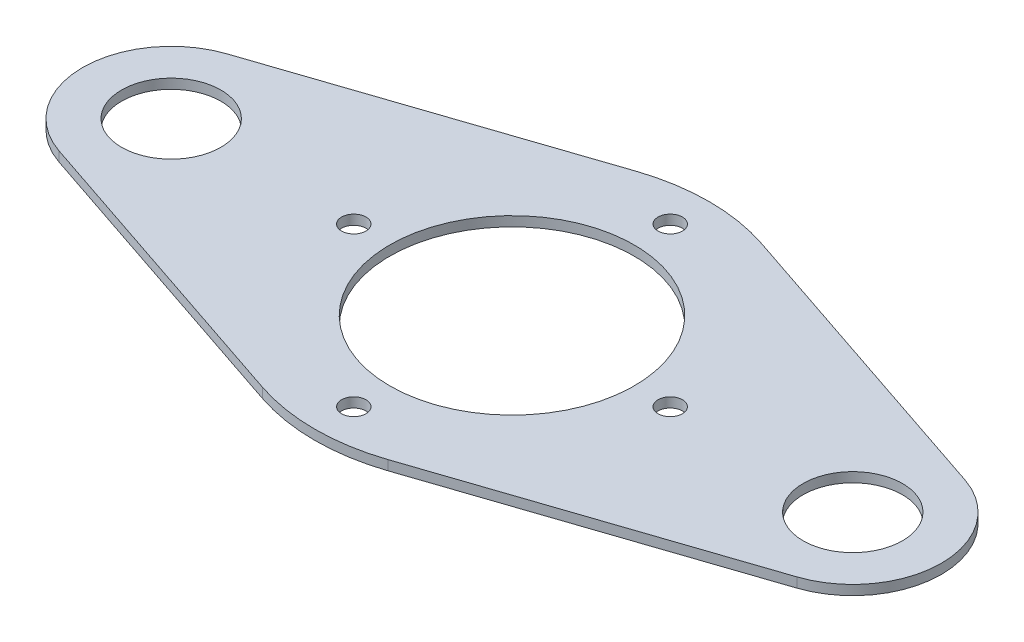
ISO-10303-21;
HEADER;
FILE_DESCRIPTION(('STEP AP214'),'2;1');
FILE_NAME('part.step','',(''),(''),'','','');
FILE_SCHEMA(('AUTOMOTIVE_DESIGN { 1 0 10303 214 1 1 1 1 }'));
ENDSEC;
DATA;
#1=APPLICATION_CONTEXT('core data for automotive mechanical design processes');
#2=APPLICATION_PROTOCOL_DEFINITION('international standard','automotive_design',2000,#1);
#3=PRODUCT_CONTEXT('',#1,'mechanical');
#4=PRODUCT('Part','Part','',(#3));
#5=PRODUCT_RELATED_PRODUCT_CATEGORY('part','',(#4));
#6=PRODUCT_DEFINITION_FORMATION('','',#4);
#7=PRODUCT_DEFINITION_CONTEXT('part definition',#1,'design');
#8=PRODUCT_DEFINITION('design','',#6,#7);
#9=PRODUCT_DEFINITION_SHAPE('','',#8);
#10=(LENGTH_UNIT() NAMED_UNIT(*) SI_UNIT(.MILLI.,.METRE.));
#11=(NAMED_UNIT(*) PLANE_ANGLE_UNIT() SI_UNIT($,.RADIAN.));
#12=(NAMED_UNIT(*) SI_UNIT($,.STERADIAN.) SOLID_ANGLE_UNIT());
#13=UNCERTAINTY_MEASURE_WITH_UNIT(LENGTH_MEASURE(1.E-05),#10,'distance_accuracy_value','');
#14=(GEOMETRIC_REPRESENTATION_CONTEXT(3) GLOBAL_UNCERTAINTY_ASSIGNED_CONTEXT((#13)) GLOBAL_UNIT_ASSIGNED_CONTEXT((#10,
#11,#12)) REPRESENTATION_CONTEXT('',''));
#15=CARTESIAN_POINT('',(0.,0.,0.));
#16=DIRECTION('',(0.,0.,1.));
#17=DIRECTION('',(1.,0.,0.));
#18=AXIS2_PLACEMENT_3D('',#15,#16,#17);
#19=CARTESIAN_POINT('',(16.3857214285714,2.54,-48.7551777585238));
#20=DIRECTION('',(0.318571428571429,0.,-0.947898857947386));
#21=DIRECTION('',(-0.947898857947386,0.,-0.318571428571429));
#22=AXIS2_PLACEMENT_3D('',#19,#20,#21);
#23=PLANE('',#22);
#24=DIRECTION('',(0.947898857947386,0.,0.318571428571429));
#25=VECTOR('',#24,1.);
#26=CARTESIAN_POINT('',(16.3857214285714,0.,-48.7551777585238));
#27=LINE('',#26,#25);
#28=CARTESIAN_POINT('',(16.3857214285714,0.,-48.7551777585238));
#29=VERTEX_POINT('',#28);
#30=CARTESIAN_POINT('',(96.26346,0.,-21.9097342025959));
#31=VERTEX_POINT('',#30);
#32=EDGE_CURVE('E150',#29,#31,#27,.T.);
#33=ORIENTED_EDGE('',*,*,#32,.F.);
#34=DIRECTION('',(0.,-1.,0.));
#35=VECTOR('',#34,1.);
#36=CARTESIAN_POINT('',(16.3857214285714,2.54,-48.7551777585238));
#37=LINE('',#36,#35);
#38=CARTESIAN_POINT('',(16.3857214285714,2.54,-48.7551777585238));
#39=VERTEX_POINT('',#38);
#40=EDGE_CURVE('E11',#39,#29,#37,.T.);
#41=ORIENTED_EDGE('',*,*,#40,.F.);
#42=DIRECTION('',(0.947898857947386,0.,0.318571428571429));
#43=VECTOR('',#42,1.);
#44=CARTESIAN_POINT('',(16.3857214285714,2.54,-48.7551777585238));
#45=LINE('',#44,#43);
#46=CARTESIAN_POINT('',(96.26346,2.54,-21.9097342025959));
#47=VERTEX_POINT('',#46);
#48=EDGE_CURVE('E259',#39,#47,#45,.T.);
#49=ORIENTED_EDGE('',*,*,#48,.T.);
#50=DIRECTION('',(0.,-1.,0.));
#51=VECTOR('',#50,1.);
#52=CARTESIAN_POINT('',(96.26346,2.54,-21.9097342025959));
#53=LINE('',#52,#51);
#54=EDGE_CURVE('E85',#47,#31,#53,.T.);
#55=ORIENTED_EDGE('',*,*,#54,.T.);
#56=EDGE_LOOP('',(#33,#41,#49,#55));
#57=FACE_BOUND('',#56,.T.);
#58=ADVANCED_FACE('F34',(#57),#23,.T.);
#59=CARTESIAN_POINT('',(0.,2.54,0.));
#60=DIRECTION('',(0.,-1.,0.));
#61=DIRECTION('',(0.,0.,-1.));
#62=AXIS2_PLACEMENT_3D('',#59,#60,#61);
#63=CYLINDRICAL_SURFACE('',#62,51.435);
#64=CARTESIAN_POINT('',(0.,0.,0.));
#65=DIRECTION('',(0.,1.,0.));
#66=DIRECTION('',(0.,0.,1.));
#67=AXIS2_PLACEMENT_3D('',#64,#65,#66);
#68=CIRCLE('',#67,51.435);
#69=CARTESIAN_POINT('',(-16.3857214285714,0.,-48.7551777585238));
#70=VERTEX_POINT('',#69);
#71=EDGE_CURVE('E148',#29,#70,#68,.T.);
#72=ORIENTED_EDGE('',*,*,#71,.T.);
#73=DIRECTION('',(0.,-1.,0.));
#74=VECTOR('',#73,1.);
#75=CARTESIAN_POINT('',(-16.3857214285714,2.54,-48.7551777585238));
#76=LINE('',#75,#74);
#77=CARTESIAN_POINT('',(-16.3857214285714,2.54,-48.7551777585238));
#78=VERTEX_POINT('',#77);
#79=EDGE_CURVE('E43',#78,#70,#76,.T.);
#80=ORIENTED_EDGE('',*,*,#79,.F.);
#81=CARTESIAN_POINT('',(0.,2.54,0.));
#82=DIRECTION('',(0.,1.,0.));
#83=DIRECTION('',(0.,0.,1.));
#84=AXIS2_PLACEMENT_3D('',#81,#82,#83);
#85=CIRCLE('',#84,51.435);
#86=EDGE_CURVE('E261',#39,#78,#85,.T.);
#87=ORIENTED_EDGE('',*,*,#86,.F.);
#88=ORIENTED_EDGE('',*,*,#40,.T.);
#89=EDGE_LOOP('',(#72,#80,#87,#88));
#90=FACE_BOUND('',#89,.T.);
#91=ADVANCED_FACE('F149',(#90),#63,.T.);
#92=CARTESIAN_POINT('',(-16.3857214285714,2.54,-48.7551777585238));
#93=DIRECTION('',(0.318571428571429,0.,0.947898857947386));
#94=DIRECTION('',(0.947898857947386,0.,-0.318571428571429));
#95=AXIS2_PLACEMENT_3D('',#92,#93,#94);
#96=PLANE('',#95);
#97=DIRECTION('',(-0.947898857947386,0.,0.318571428571429));
#98=VECTOR('',#97,1.);
#99=CARTESIAN_POINT('',(-16.3857214285714,0.,-48.7551777585238));
#100=LINE('',#99,#98);
#101=CARTESIAN_POINT('',(-96.26346,0.,-21.9097342025959));
#102=VERTEX_POINT('',#101);
#103=EDGE_CURVE('E142',#70,#102,#100,.T.);
#104=ORIENTED_EDGE('',*,*,#103,.T.);
#105=DIRECTION('',(0.,-1.,0.));
#106=VECTOR('',#105,1.);
#107=CARTESIAN_POINT('',(-96.26346,2.54,-21.9097342025959));
#108=LINE('',#107,#106);
#109=CARTESIAN_POINT('',(-96.26346,2.54,-21.9097342025959));
#110=VERTEX_POINT('',#109);
#111=EDGE_CURVE('E134',#110,#102,#108,.T.);
#112=ORIENTED_EDGE('',*,*,#111,.F.);
#113=DIRECTION('',(-0.947898857947386,0.,0.318571428571429));
#114=VECTOR('',#113,1.);
#115=CARTESIAN_POINT('',(-16.3857214285714,2.54,-48.7551777585238));
#116=LINE('',#115,#114);
#117=EDGE_CURVE('E144',#78,#110,#116,.T.);
#118=ORIENTED_EDGE('',*,*,#117,.F.);
#119=ORIENTED_EDGE('',*,*,#79,.T.);
#120=EDGE_LOOP('',(#104,#112,#118,#119));
#121=FACE_BOUND('',#120,.T.);
#122=ADVANCED_FACE('F140',(#121),#96,.F.);
#123=CARTESIAN_POINT('',(-88.9,2.54,0.));
#124=DIRECTION('',(0.,-1.,0.));
#125=DIRECTION('',(0.,0.,-1.));
#126=AXIS2_PLACEMENT_3D('',#123,#124,#125);
#127=CYLINDRICAL_SURFACE('',#126,23.114);
#128=CARTESIAN_POINT('',(-88.9,0.,0.));
#129=DIRECTION('',(0.,1.,0.));
#130=DIRECTION('',(0.,0.,1.));
#131=AXIS2_PLACEMENT_3D('',#128,#129,#130);
#132=CIRCLE('',#131,23.114);
#133=CARTESIAN_POINT('',(-96.26346,0.,21.9097342025959));
#134=VERTEX_POINT('',#133);
#135=EDGE_CURVE('E152',#134,#102,#132,.F.);
#136=ORIENTED_EDGE('',*,*,#135,.F.);
#137=DIRECTION('',(0.,-1.,0.));
#138=VECTOR('',#137,1.);
#139=CARTESIAN_POINT('',(-96.26346,2.54,21.9097342025959));
#140=LINE('',#139,#138);
#141=CARTESIAN_POINT('',(-96.26346,2.54,21.9097342025959));
#142=VERTEX_POINT('',#141);
#143=EDGE_CURVE('E128',#142,#134,#140,.T.);
#144=ORIENTED_EDGE('',*,*,#143,.F.);
#145=CARTESIAN_POINT('',(-88.9,2.54,0.));
#146=DIRECTION('',(0.,1.,0.));
#147=DIRECTION('',(0.,0.,1.));
#148=AXIS2_PLACEMENT_3D('',#145,#146,#147);
#149=CIRCLE('',#148,23.114);
#150=EDGE_CURVE('E268',#142,#110,#149,.F.);
#151=ORIENTED_EDGE('',*,*,#150,.T.);
#152=ORIENTED_EDGE('',*,*,#111,.T.);
#153=EDGE_LOOP('',(#136,#144,#151,#152));
#154=FACE_BOUND('',#153,.T.);
#155=ADVANCED_FACE('F213',(#154),#127,.T.);
#156=CARTESIAN_POINT('',(-16.3857214285714,2.54,48.7551777585238));
#157=DIRECTION('',(-0.318571428571429,0.,0.947898857947386));
#158=DIRECTION('',(0.947898857947386,0.,0.318571428571429));
#159=AXIS2_PLACEMENT_3D('',#156,#157,#158);
#160=PLANE('',#159);
#161=DIRECTION('',(-0.947898857947386,0.,-0.318571428571429));
#162=VECTOR('',#161,1.);
#163=CARTESIAN_POINT('',(-16.3857214285714,0.,48.7551777585238));
#164=LINE('',#163,#162);
#165=CARTESIAN_POINT('',(-16.3857214285714,0.,48.7551777585238));
#166=VERTEX_POINT('',#165);
#167=EDGE_CURVE('E159',#166,#134,#164,.T.);
#168=ORIENTED_EDGE('',*,*,#167,.F.);
#169=DIRECTION('',(0.,-1.,0.));
#170=VECTOR('',#169,1.);
#171=CARTESIAN_POINT('',(-16.3857214285714,2.54,48.7551777585238));
#172=LINE('',#171,#170);
#173=CARTESIAN_POINT('',(-16.3857214285714,2.54,48.7551777585238));
#174=VERTEX_POINT('',#173);
#175=EDGE_CURVE('E126',#174,#166,#172,.T.);
#176=ORIENTED_EDGE('',*,*,#175,.F.);
#177=DIRECTION('',(-0.947898857947386,0.,-0.318571428571429));
#178=VECTOR('',#177,1.);
#179=CARTESIAN_POINT('',(-16.3857214285714,2.54,48.7551777585238));
#180=LINE('',#179,#178);
#181=EDGE_CURVE('E120',#174,#142,#180,.T.);
#182=ORIENTED_EDGE('',*,*,#181,.T.);
#183=ORIENTED_EDGE('',*,*,#143,.T.);
#184=EDGE_LOOP('',(#168,#176,#182,#183));
#185=FACE_BOUND('',#184,.T.);
#186=ADVANCED_FACE('F216',(#185),#160,.T.);
#187=CARTESIAN_POINT('',(0.,2.54,0.));
#188=DIRECTION('',(0.,-1.,0.));
#189=DIRECTION('',(0.,0.,-1.));
#190=AXIS2_PLACEMENT_3D('',#187,#188,#189);
#191=CYLINDRICAL_SURFACE('',#190,51.4349999999998);
#192=CARTESIAN_POINT('',(0.,0.,0.));
#193=DIRECTION('',(0.,1.,0.));
#194=DIRECTION('',(0.,0.,1.));
#195=AXIS2_PLACEMENT_3D('',#192,#193,#194);
#196=CIRCLE('',#195,51.4349999999998);
#197=CARTESIAN_POINT('',(16.3857214285714,0.,48.7551777585238));
#198=VERTEX_POINT('',#197);
#199=EDGE_CURVE('E125',#166,#198,#196,.T.);
#200=ORIENTED_EDGE('',*,*,#199,.T.);
#201=DIRECTION('',(0.,-1.,0.));
#202=VECTOR('',#201,1.);
#203=CARTESIAN_POINT('',(16.3857214285714,2.54,48.7551777585238));
#204=LINE('',#203,#202);
#205=CARTESIAN_POINT('',(16.3857214285714,2.54,48.7551777585238));
#206=VERTEX_POINT('',#205);
#207=EDGE_CURVE('E110',#206,#198,#204,.T.);
#208=ORIENTED_EDGE('',*,*,#207,.F.);
#209=CARTESIAN_POINT('',(0.,2.54,0.));
#210=DIRECTION('',(0.,1.,0.));
#211=DIRECTION('',(0.,0.,1.));
#212=AXIS2_PLACEMENT_3D('',#209,#210,#211);
#213=CIRCLE('',#212,51.4349999999998);
#214=EDGE_CURVE('E113',#174,#206,#213,.T.);
#215=ORIENTED_EDGE('',*,*,#214,.F.);
#216=ORIENTED_EDGE('',*,*,#175,.T.);
#217=EDGE_LOOP('',(#200,#208,#215,#216));
#218=FACE_BOUND('',#217,.T.);
#219=ADVANCED_FACE('F123',(#218),#191,.T.);
#220=CARTESIAN_POINT('',(16.3857214285714,2.54,48.7551777585238));
#221=DIRECTION('',(-0.318571428571429,0.,-0.947898857947386));
#222=DIRECTION('',(-0.947898857947386,0.,0.318571428571429));
#223=AXIS2_PLACEMENT_3D('',#220,#221,#222);
#224=PLANE('',#223);
#225=DIRECTION('',(0.947898857947386,0.,-0.318571428571429));
#226=VECTOR('',#225,1.);
#227=CARTESIAN_POINT('',(16.3857214285714,0.,48.7551777585238));
#228=LINE('',#227,#226);
#229=CARTESIAN_POINT('',(96.26346,0.,21.9097342025959));
#230=VERTEX_POINT('',#229);
#231=EDGE_CURVE('E163',#198,#230,#228,.T.);
#232=ORIENTED_EDGE('',*,*,#231,.T.);
#233=DIRECTION('',(0.,-1.,0.));
#234=VECTOR('',#233,1.);
#235=CARTESIAN_POINT('',(96.26346,2.54,21.9097342025959));
#236=LINE('',#235,#234);
#237=CARTESIAN_POINT('',(96.26346,2.54,21.9097342025959));
#238=VERTEX_POINT('',#237);
#239=EDGE_CURVE('E112',#238,#230,#236,.T.);
#240=ORIENTED_EDGE('',*,*,#239,.F.);
#241=DIRECTION('',(0.947898857947386,0.,-0.318571428571429));
#242=VECTOR('',#241,1.);
#243=CARTESIAN_POINT('',(16.3857214285714,2.54,48.7551777585238));
#244=LINE('',#243,#242);
#245=EDGE_CURVE('E105',#206,#238,#244,.T.);
#246=ORIENTED_EDGE('',*,*,#245,.F.);
#247=ORIENTED_EDGE('',*,*,#207,.T.);
#248=EDGE_LOOP('',(#232,#240,#246,#247));
#249=FACE_BOUND('',#248,.T.);
#250=ADVANCED_FACE('F108',(#249),#224,.F.);
#251=CARTESIAN_POINT('',(0.,2.54,0.));
#252=DIRECTION('',(0.,-1.,0.));
#253=DIRECTION('',(0.,0.,-1.));
#254=AXIS2_PLACEMENT_3D('',#251,#252,#253);
#255=CYLINDRICAL_SURFACE('',#254,31.877);
#256=CARTESIAN_POINT('',(0.,2.54,0.));
#257=DIRECTION('',(0.,1.,0.));
#258=DIRECTION('',(0.,0.,1.));
#259=AXIS2_PLACEMENT_3D('',#256,#257,#258);
#260=CIRCLE('',#259,31.877);
#261=CARTESIAN_POINT('',(0.,2.54,31.877));
#262=VERTEX_POINT('',#261);
#263=EDGE_CURVE('E258',#262,#262,#260,.T.);
#264=ORIENTED_EDGE('',*,*,#263,.T.);
#265=EDGE_LOOP('',(#264));
#266=FACE_BOUND('',#265,.T.);
#267=CARTESIAN_POINT('',(0.,0.,0.));
#268=DIRECTION('',(0.,1.,0.));
#269=DIRECTION('',(0.,0.,1.));
#270=AXIS2_PLACEMENT_3D('',#267,#268,#269);
#271=CIRCLE('',#270,31.877);
#272=CARTESIAN_POINT('',(0.,0.,31.877));
#273=VERTEX_POINT('',#272);
#274=EDGE_CURVE('E154',#273,#273,#271,.T.);
#275=ORIENTED_EDGE('',*,*,#274,.F.);
#276=EDGE_LOOP('',(#275));
#277=FACE_BOUND('',#276,.T.);
#278=ADVANCED_FACE('F190',(#266,#277),#255,.F.);
#279=CARTESIAN_POINT('',(88.9,2.54,0.));
#280=DIRECTION('',(0.,-1.,0.));
#281=DIRECTION('',(0.,0.,-1.));
#282=AXIS2_PLACEMENT_3D('',#279,#280,#281);
#283=CYLINDRICAL_SURFACE('',#282,12.954);
#284=CARTESIAN_POINT('',(88.9,2.54,0.));
#285=DIRECTION('',(0.,1.,0.));
#286=DIRECTION('',(0.,0.,1.));
#287=AXIS2_PLACEMENT_3D('',#284,#285,#286);
#288=CIRCLE('',#287,12.954);
#289=CARTESIAN_POINT('',(88.9,2.54,12.954));
#290=VERTEX_POINT('',#289);
#291=EDGE_CURVE('E256',#290,#290,#288,.T.);
#292=ORIENTED_EDGE('',*,*,#291,.T.);
#293=EDGE_LOOP('',(#292));
#294=FACE_BOUND('',#293,.T.);
#295=CARTESIAN_POINT('',(88.9,0.,0.));
#296=DIRECTION('',(0.,1.,0.));
#297=DIRECTION('',(0.,0.,1.));
#298=AXIS2_PLACEMENT_3D('',#295,#296,#297);
#299=CIRCLE('',#298,12.954);
#300=CARTESIAN_POINT('',(88.9,0.,12.954));
#301=VERTEX_POINT('',#300);
#302=EDGE_CURVE('E183',#301,#301,#299,.T.);
#303=ORIENTED_EDGE('',*,*,#302,.F.);
#304=EDGE_LOOP('',(#303));
#305=FACE_BOUND('',#304,.T.);
#306=ADVANCED_FACE('F192',(#294,#305),#283,.F.);
#307=CARTESIAN_POINT('',(0.,2.54,-41.275));
#308=DIRECTION('',(0.,-1.,0.));
#309=DIRECTION('',(0.,0.,-1.));
#310=AXIS2_PLACEMENT_3D('',#307,#308,#309);
#311=CYLINDRICAL_SURFACE('',#310,3.175);
#312=CARTESIAN_POINT('',(0.,2.54,-41.275));
#313=DIRECTION('',(0.,1.,0.));
#314=DIRECTION('',(0.,0.,1.));
#315=AXIS2_PLACEMENT_3D('',#312,#313,#314);
#316=CIRCLE('',#315,3.175);
#317=CARTESIAN_POINT('',(0.,2.54,-38.1));
#318=VERTEX_POINT('',#317);
#319=EDGE_CURVE('E252',#318,#318,#316,.T.);
#320=ORIENTED_EDGE('',*,*,#319,.T.);
#321=EDGE_LOOP('',(#320));
#322=FACE_BOUND('',#321,.T.);
#323=CARTESIAN_POINT('',(0.,0.,-41.275));
#324=DIRECTION('',(0.,1.,0.));
#325=DIRECTION('',(0.,0.,1.));
#326=AXIS2_PLACEMENT_3D('',#323,#324,#325);
#327=CIRCLE('',#326,3.175);
#328=CARTESIAN_POINT('',(0.,0.,-38.1));
#329=VERTEX_POINT('',#328);
#330=EDGE_CURVE('E180',#329,#329,#327,.T.);
#331=ORIENTED_EDGE('',*,*,#330,.F.);
#332=EDGE_LOOP('',(#331));
#333=FACE_BOUND('',#332,.T.);
#334=ADVANCED_FACE('F199',(#322,#333),#311,.F.);
#335=CARTESIAN_POINT('',(41.2750000000012,2.54,-1.16805132707644E-12));
#336=DIRECTION('',(0.,-1.,0.));
#337=DIRECTION('',(0.,0.,-1.));
#338=AXIS2_PLACEMENT_3D('',#335,#336,#337);
#339=CYLINDRICAL_SURFACE('',#338,3.17500000000091);
#340=CARTESIAN_POINT('',(41.2750000000012,2.54,-1.16805132707644E-12));
#341=DIRECTION('',(0.,1.,0.));
#342=DIRECTION('',(0.,0.,1.));
#343=AXIS2_PLACEMENT_3D('',#340,#341,#342);
#344=CIRCLE('',#343,3.17500000000091);
#345=CARTESIAN_POINT('',(41.2750000000012,2.54,3.17499999999974));
#346=VERTEX_POINT('',#345);
#347=EDGE_CURVE('E248',#346,#346,#344,.T.);
#348=ORIENTED_EDGE('',*,*,#347,.T.);
#349=EDGE_LOOP('',(#348));
#350=FACE_BOUND('',#349,.T.);
#351=CARTESIAN_POINT('',(41.2750000000012,0.,-1.16805132707644E-12));
#352=DIRECTION('',(0.,1.,0.));
#353=DIRECTION('',(0.,0.,1.));
#354=AXIS2_PLACEMENT_3D('',#351,#352,#353);
#355=CIRCLE('',#354,3.17500000000091);
#356=CARTESIAN_POINT('',(41.2750000000012,0.,3.17499999999974));
#357=VERTEX_POINT('',#356);
#358=EDGE_CURVE('E177',#357,#357,#355,.T.);
#359=ORIENTED_EDGE('',*,*,#358,.F.);
#360=EDGE_LOOP('',(#359));
#361=FACE_BOUND('',#360,.T.);
#362=ADVANCED_FACE('F295',(#350,#361),#339,.F.);
#363=CARTESIAN_POINT('',(2.33610265415289E-12,2.54,41.275));
#364=DIRECTION('',(0.,-1.,0.));
#365=DIRECTION('',(0.,0.,-1.));
#366=AXIS2_PLACEMENT_3D('',#363,#364,#365);
#367=CYLINDRICAL_SURFACE('',#366,3.17500000000251);
#368=CARTESIAN_POINT('',(2.33610265415289E-12,2.54,41.275));
#369=DIRECTION('',(0.,1.,0.));
#370=DIRECTION('',(0.,0.,1.));
#371=AXIS2_PLACEMENT_3D('',#368,#369,#370);
#372=CIRCLE('',#371,3.17500000000251);
#373=CARTESIAN_POINT('',(2.33610265415289E-12,2.54,44.4500000000025));
#374=VERTEX_POINT('',#373);
#375=EDGE_CURVE('E244',#374,#374,#372,.T.);
#376=ORIENTED_EDGE('',*,*,#375,.T.);
#377=EDGE_LOOP('',(#376));
#378=FACE_BOUND('',#377,.T.);
#379=CARTESIAN_POINT('',(2.33610265415289E-12,0.,41.275));
#380=DIRECTION('',(0.,1.,0.));
#381=DIRECTION('',(0.,0.,1.));
#382=AXIS2_PLACEMENT_3D('',#379,#380,#381);
#383=CIRCLE('',#382,3.17500000000251);
#384=CARTESIAN_POINT('',(2.33610265415289E-12,0.,44.4500000000025));
#385=VERTEX_POINT('',#384);
#386=EDGE_CURVE('E174',#385,#385,#383,.T.);
#387=ORIENTED_EDGE('',*,*,#386,.F.);
#388=EDGE_LOOP('',(#387));
#389=FACE_BOUND('',#388,.T.);
#390=ADVANCED_FACE('F281',(#378,#389),#367,.F.);
#391=CARTESIAN_POINT('',(-41.2749999999988,2.54,1.17310605673993E-12));
#392=DIRECTION('',(0.,-1.,0.));
#393=DIRECTION('',(0.,0.,-1.));
#394=AXIS2_PLACEMENT_3D('',#391,#392,#393);
#395=CYLINDRICAL_SURFACE('',#394,3.17500000000187);
#396=CARTESIAN_POINT('',(-41.2749999999988,2.54,1.17310605673993E-12));
#397=DIRECTION('',(0.,1.,0.));
#398=DIRECTION('',(0.,0.,1.));
#399=AXIS2_PLACEMENT_3D('',#396,#397,#398);
#400=CIRCLE('',#399,3.17500000000187);
#401=CARTESIAN_POINT('',(-41.2749999999988,2.54,3.17500000000305));
#402=VERTEX_POINT('',#401);
#403=EDGE_CURVE('E240',#402,#402,#400,.T.);
#404=ORIENTED_EDGE('',*,*,#403,.T.);
#405=EDGE_LOOP('',(#404));
#406=FACE_BOUND('',#405,.T.);
#407=CARTESIAN_POINT('',(-41.2749999999988,0.,1.17310605673993E-12));
#408=DIRECTION('',(0.,1.,0.));
#409=DIRECTION('',(0.,0.,1.));
#410=AXIS2_PLACEMENT_3D('',#407,#408,#409);
#411=CIRCLE('',#410,3.17500000000187);
#412=CARTESIAN_POINT('',(-41.2749999999988,0.,3.17500000000305));
#413=VERTEX_POINT('',#412);
#414=EDGE_CURVE('E171',#413,#413,#411,.T.);
#415=ORIENTED_EDGE('',*,*,#414,.F.);
#416=EDGE_LOOP('',(#415));
#417=FACE_BOUND('',#416,.T.);
#418=ADVANCED_FACE('F278',(#406,#417),#395,.F.);
#419=CARTESIAN_POINT('',(-88.9,2.54,0.));
#420=DIRECTION('',(0.,-1.,0.));
#421=DIRECTION('',(0.,0.,-1.));
#422=AXIS2_PLACEMENT_3D('',#419,#420,#421);
#423=CYLINDRICAL_SURFACE('',#422,12.954);
#424=CARTESIAN_POINT('',(-88.9,2.54,0.));
#425=DIRECTION('',(0.,1.,0.));
#426=DIRECTION('',(0.,0.,1.));
#427=AXIS2_PLACEMENT_3D('',#424,#425,#426);
#428=CIRCLE('',#427,12.954);
#429=CARTESIAN_POINT('',(-88.9,2.54,12.954));
#430=VERTEX_POINT('',#429);
#431=EDGE_CURVE('E165',#430,#430,#428,.F.);
#432=ORIENTED_EDGE('',*,*,#431,.F.);
#433=EDGE_LOOP('',(#432));
#434=FACE_BOUND('',#433,.T.);
#435=CARTESIAN_POINT('',(-88.9,0.,0.));
#436=DIRECTION('',(0.,1.,0.));
#437=DIRECTION('',(0.,0.,1.));
#438=AXIS2_PLACEMENT_3D('',#435,#436,#437);
#439=CIRCLE('',#438,12.954);
#440=CARTESIAN_POINT('',(-88.9,0.,12.954));
#441=VERTEX_POINT('',#440);
#442=EDGE_CURVE('E168',#441,#441,#439,.F.);
#443=ORIENTED_EDGE('',*,*,#442,.T.);
#444=EDGE_LOOP('',(#443));
#445=FACE_BOUND('',#444,.T.);
#446=ADVANCED_FACE('F36',(#434,#445),#423,.F.);
#447=CARTESIAN_POINT('',(88.9,2.54,0.));
#448=DIRECTION('',(0.,-1.,0.));
#449=DIRECTION('',(0.,0.,-1.));
#450=AXIS2_PLACEMENT_3D('',#447,#448,#449);
#451=CYLINDRICAL_SURFACE('',#450,23.114);
#452=CARTESIAN_POINT('',(88.9,0.,0.));
#453=DIRECTION('',(0.,1.,0.));
#454=DIRECTION('',(0.,0.,1.));
#455=AXIS2_PLACEMENT_3D('',#452,#453,#454);
#456=CIRCLE('',#455,23.114);
#457=EDGE_CURVE('E78',#230,#31,#456,.T.);
#458=ORIENTED_EDGE('',*,*,#457,.T.);
#459=ORIENTED_EDGE('',*,*,#54,.F.);
#460=CARTESIAN_POINT('',(88.9,2.54,0.));
#461=DIRECTION('',(0.,1.,0.));
#462=DIRECTION('',(0.,0.,1.));
#463=AXIS2_PLACEMENT_3D('',#460,#461,#462);
#464=CIRCLE('',#463,23.114);
#465=EDGE_CURVE('E51',#238,#47,#464,.T.);
#466=ORIENTED_EDGE('',*,*,#465,.F.);
#467=ORIENTED_EDGE('',*,*,#239,.T.);
#468=EDGE_LOOP('',(#458,#459,#466,#467));
#469=FACE_BOUND('',#468,.T.);
#470=ADVANCED_FACE('F223',(#469),#451,.T.);
#471=CARTESIAN_POINT('',(0.,2.54,0.));
#472=DIRECTION('',(0.,1.,0.));
#473=DIRECTION('',(0.,0.,1.));
#474=AXIS2_PLACEMENT_3D('',#471,#472,#473);
#475=PLANE('',#474);
#476=ORIENTED_EDGE('',*,*,#431,.T.);
#477=EDGE_LOOP('',(#476));
#478=FACE_BOUND('',#477,.T.);
#479=ORIENTED_EDGE('',*,*,#403,.F.);
#480=EDGE_LOOP('',(#479));
#481=FACE_BOUND('',#480,.T.);
#482=ORIENTED_EDGE('',*,*,#375,.F.);
#483=EDGE_LOOP('',(#482));
#484=FACE_BOUND('',#483,.T.);
#485=ORIENTED_EDGE('',*,*,#347,.F.);
#486=EDGE_LOOP('',(#485));
#487=FACE_BOUND('',#486,.T.);
#488=ORIENTED_EDGE('',*,*,#319,.F.);
#489=EDGE_LOOP('',(#488));
#490=FACE_BOUND('',#489,.T.);
#491=ORIENTED_EDGE('',*,*,#291,.F.);
#492=EDGE_LOOP('',(#491));
#493=FACE_BOUND('',#492,.T.);
#494=ORIENTED_EDGE('',*,*,#263,.F.);
#495=EDGE_LOOP('',(#494));
#496=FACE_BOUND('',#495,.T.);
#497=ORIENTED_EDGE('',*,*,#48,.F.);
#498=ORIENTED_EDGE('',*,*,#86,.T.);
#499=ORIENTED_EDGE('',*,*,#117,.T.);
#500=ORIENTED_EDGE('',*,*,#150,.F.);
#501=ORIENTED_EDGE('',*,*,#181,.F.);
#502=ORIENTED_EDGE('',*,*,#214,.T.);
#503=ORIENTED_EDGE('',*,*,#245,.T.);
#504=ORIENTED_EDGE('',*,*,#465,.T.);
#505=EDGE_LOOP('',(#497,#498,#499,#500,#501,#502,#503,#504));
#506=FACE_BOUND('',#505,.T.);
#507=ADVANCED_FACE('F117',(#478,#481,#484,#487,#490,#493,#496,#506),#475,.T.);
#508=CARTESIAN_POINT('',(0.,0.,0.));
#509=DIRECTION('',(0.,1.,0.));
#510=DIRECTION('',(0.,0.,1.));
#511=AXIS2_PLACEMENT_3D('',#508,#509,#510);
#512=PLANE('',#511);
#513=ORIENTED_EDGE('',*,*,#442,.F.);
#514=EDGE_LOOP('',(#513));
#515=FACE_BOUND('',#514,.T.);
#516=ORIENTED_EDGE('',*,*,#414,.T.);
#517=EDGE_LOOP('',(#516));
#518=FACE_BOUND('',#517,.T.);
#519=ORIENTED_EDGE('',*,*,#386,.T.);
#520=EDGE_LOOP('',(#519));
#521=FACE_BOUND('',#520,.T.);
#522=ORIENTED_EDGE('',*,*,#358,.T.);
#523=EDGE_LOOP('',(#522));
#524=FACE_BOUND('',#523,.T.);
#525=ORIENTED_EDGE('',*,*,#330,.T.);
#526=EDGE_LOOP('',(#525));
#527=FACE_BOUND('',#526,.T.);
#528=ORIENTED_EDGE('',*,*,#302,.T.);
#529=EDGE_LOOP('',(#528));
#530=FACE_BOUND('',#529,.T.);
#531=ORIENTED_EDGE('',*,*,#274,.T.);
#532=EDGE_LOOP('',(#531));
#533=FACE_BOUND('',#532,.T.);
#534=ORIENTED_EDGE('',*,*,#32,.T.);
#535=ORIENTED_EDGE('',*,*,#457,.F.);
#536=ORIENTED_EDGE('',*,*,#231,.F.);
#537=ORIENTED_EDGE('',*,*,#199,.F.);
#538=ORIENTED_EDGE('',*,*,#167,.T.);
#539=ORIENTED_EDGE('',*,*,#135,.T.);
#540=ORIENTED_EDGE('',*,*,#103,.F.);
#541=ORIENTED_EDGE('',*,*,#71,.F.);
#542=EDGE_LOOP('',(#534,#535,#536,#537,#538,#539,#540,#541));
#543=FACE_BOUND('',#542,.T.);
#544=ADVANCED_FACE('F188',(#515,#518,#521,#524,#527,#530,#533,#543),#512,.F.);
#545=CLOSED_SHELL('',(#58,#91,#122,#155,#186,#219,#250,#278,#306,#334,#362,#390,#418,#446,#470,
#507,#544));
#546=MANIFOLD_SOLID_BREP('B2',#545);
#547=ADVANCED_BREP_SHAPE_REPRESENTATION('',(#18,#546),#14);
#548=SHAPE_DEFINITION_REPRESENTATION(#9,#547);
ENDSEC;
END-ISO-10303-21;
